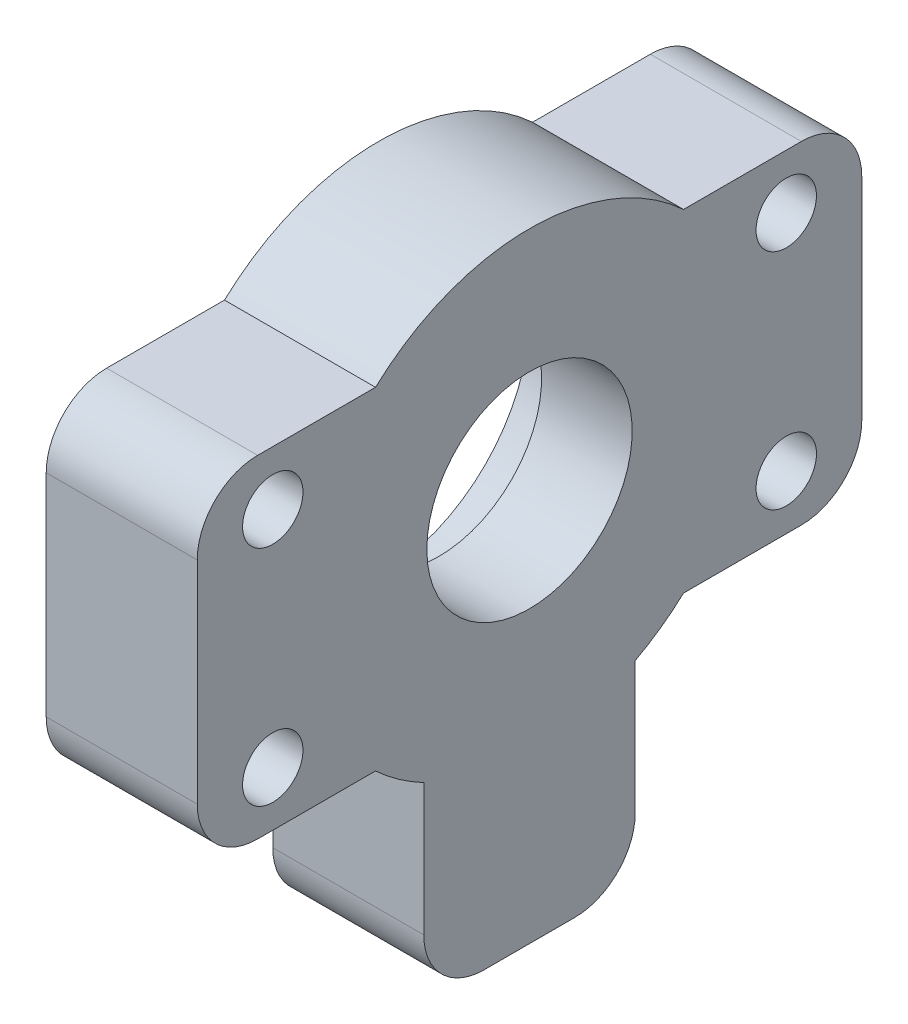
ISO-10303-21;
HEADER;
FILE_DESCRIPTION(('STEP AP214'),'2;1');
FILE_NAME('part.step','',(''),(''),'','','');
FILE_SCHEMA(('AUTOMOTIVE_DESIGN { 1 0 10303 214 1 1 1 1 }'));
ENDSEC;
DATA;
#1=APPLICATION_CONTEXT('core data for automotive mechanical design processes');
#2=APPLICATION_PROTOCOL_DEFINITION('international standard','automotive_design',2000,#1);
#3=PRODUCT_CONTEXT('',#1,'mechanical');
#4=PRODUCT('Part','Part','',(#3));
#5=PRODUCT_RELATED_PRODUCT_CATEGORY('part','',(#4));
#6=PRODUCT_DEFINITION_FORMATION('','',#4);
#7=PRODUCT_DEFINITION_CONTEXT('part definition',#1,'design');
#8=PRODUCT_DEFINITION('design','',#6,#7);
#9=PRODUCT_DEFINITION_SHAPE('','',#8);
#10=(LENGTH_UNIT() NAMED_UNIT(*) SI_UNIT(.MILLI.,.METRE.));
#11=(NAMED_UNIT(*) PLANE_ANGLE_UNIT() SI_UNIT($,.RADIAN.));
#12=(NAMED_UNIT(*) SI_UNIT($,.STERADIAN.) SOLID_ANGLE_UNIT());
#13=UNCERTAINTY_MEASURE_WITH_UNIT(LENGTH_MEASURE(1.E-05),#10,'distance_accuracy_value','');
#14=(GEOMETRIC_REPRESENTATION_CONTEXT(3) GLOBAL_UNCERTAINTY_ASSIGNED_CONTEXT((#13)) GLOBAL_UNIT_ASSIGNED_CONTEXT((#10,
#11,#12)) REPRESENTATION_CONTEXT('',''));
#15=CARTESIAN_POINT('',(0.,0.,0.));
#16=DIRECTION('',(0.,0.,1.));
#17=DIRECTION('',(1.,0.,0.));
#18=AXIS2_PLACEMENT_3D('',#15,#16,#17);
#19=CARTESIAN_POINT('',(5.,0.,0.));
#20=DIRECTION('',(-1.,0.,0.));
#21=DIRECTION('',(0.,0.,1.));
#22=AXIS2_PLACEMENT_3D('',#19,#20,#21);
#23=CYLINDRICAL_SURFACE('',#22,7.5);
#24=CARTESIAN_POINT('',(5.,0.,0.));
#25=DIRECTION('',(1.,0.,0.));
#26=DIRECTION('',(0.,0.,-1.));
#27=AXIS2_PLACEMENT_3D('',#24,#25,#26);
#28=CIRCLE('',#27,7.5);
#29=CARTESIAN_POINT('',(5.,-6.6332495807108,-3.5));
#30=VERTEX_POINT('',#29);
#31=CARTESIAN_POINT('',(5.,-5.5,-5.09901951359279));
#32=VERTEX_POINT('',#31);
#33=EDGE_CURVE('E189',#30,#32,#28,.T.);
#34=ORIENTED_EDGE('',*,*,#33,.F.);
#35=DIRECTION('',(-1.,0.,0.));
#36=VECTOR('',#35,1.);
#37=CARTESIAN_POINT('',(5.,-6.6332495807108,-3.5));
#38=LINE('',#37,#36);
#39=CARTESIAN_POINT('',(0.,-6.6332495807108,-3.5));
#40=VERTEX_POINT('',#39);
#41=EDGE_CURVE('E179',#30,#40,#38,.T.);
#42=ORIENTED_EDGE('',*,*,#41,.T.);
#43=CARTESIAN_POINT('',(0.,0.,0.));
#44=DIRECTION('',(1.,0.,0.));
#45=DIRECTION('',(0.,0.,-1.));
#46=AXIS2_PLACEMENT_3D('',#43,#44,#45);
#47=CIRCLE('',#46,7.5);
#48=CARTESIAN_POINT('',(0.,-5.5,-5.09901951359279));
#49=VERTEX_POINT('',#48);
#50=EDGE_CURVE('E200',#40,#49,#47,.T.);
#51=ORIENTED_EDGE('',*,*,#50,.T.);
#52=DIRECTION('',(-1.,0.,0.));
#53=VECTOR('',#52,1.);
#54=CARTESIAN_POINT('',(5.,-5.5,-5.09901951359279));
#55=LINE('',#54,#53);
#56=EDGE_CURVE('E241',#49,#32,#55,.F.);
#57=ORIENTED_EDGE('',*,*,#56,.T.);
#58=EDGE_LOOP('',(#34,#42,#51,#57));
#59=FACE_BOUND('',#58,.T.);
#60=ADVANCED_FACE('F35',(#59),#23,.T.);
#61=CARTESIAN_POINT('',(5.,5.5,-5.09901951359279));
#62=VERTEX_POINT('',#61);
#63=CARTESIAN_POINT('',(5.,5.5,5.09901951359279));
#64=VERTEX_POINT('',#63);
#65=EDGE_CURVE('E191',#62,#64,#28,.T.);
#66=ORIENTED_EDGE('',*,*,#65,.F.);
#67=DIRECTION('',(-1.,0.,0.));
#68=VECTOR('',#67,1.);
#69=CARTESIAN_POINT('',(5.,5.5,-5.09901951359279));
#70=LINE('',#69,#68);
#71=CARTESIAN_POINT('',(0.,5.5,-5.09901951359279));
#72=VERTEX_POINT('',#71);
#73=EDGE_CURVE('E234',#62,#72,#70,.T.);
#74=ORIENTED_EDGE('',*,*,#73,.T.);
#75=CARTESIAN_POINT('',(0.,5.5,5.09901951359279));
#76=VERTEX_POINT('',#75);
#77=EDGE_CURVE('E201',#72,#76,#47,.T.);
#78=ORIENTED_EDGE('',*,*,#77,.T.);
#79=DIRECTION('',(-1.,0.,0.));
#80=VECTOR('',#79,1.);
#81=CARTESIAN_POINT('',(5.,5.5,5.09901951359279));
#82=LINE('',#81,#80);
#83=EDGE_CURVE('E219',#76,#64,#82,.F.);
#84=ORIENTED_EDGE('',*,*,#83,.T.);
#85=EDGE_LOOP('',(#66,#74,#78,#84));
#86=FACE_BOUND('',#85,.T.);
#87=ADVANCED_FACE('F368',(#86),#23,.T.);
#88=CARTESIAN_POINT('',(0.,-5.5,5.09901951359279));
#89=VERTEX_POINT('',#88);
#90=CARTESIAN_POINT('',(0.,-6.6332495807108,3.5));
#91=VERTEX_POINT('',#90);
#92=EDGE_CURVE('E178',#89,#91,#47,.T.);
#93=ORIENTED_EDGE('',*,*,#92,.T.);
#94=DIRECTION('',(-1.,0.,0.));
#95=VECTOR('',#94,1.);
#96=CARTESIAN_POINT('',(5.,-6.6332495807108,3.5));
#97=LINE('',#96,#95);
#98=CARTESIAN_POINT('',(5.,-6.6332495807108,3.5));
#99=VERTEX_POINT('',#98);
#100=EDGE_CURVE('E165',#91,#99,#97,.F.);
#101=ORIENTED_EDGE('',*,*,#100,.T.);
#102=CARTESIAN_POINT('',(5.,-5.5,5.09901951359279));
#103=VERTEX_POINT('',#102);
#104=EDGE_CURVE('E176',#103,#99,#28,.T.);
#105=ORIENTED_EDGE('',*,*,#104,.F.);
#106=DIRECTION('',(-1.,0.,0.));
#107=VECTOR('',#106,1.);
#108=CARTESIAN_POINT('',(5.,-5.5,5.09901951359279));
#109=LINE('',#108,#107);
#110=EDGE_CURVE('E223',#103,#89,#109,.T.);
#111=ORIENTED_EDGE('',*,*,#110,.T.);
#112=EDGE_LOOP('',(#93,#101,#105,#111));
#113=FACE_BOUND('',#112,.T.);
#114=ADVANCED_FACE('F174',(#113),#23,.T.);
#115=CARTESIAN_POINT('',(5.,0.,0.));
#116=DIRECTION('',(1.,0.,0.));
#117=DIRECTION('',(0.,0.,-1.));
#118=AXIS2_PLACEMENT_3D('',#115,#116,#117);
#119=PLANE('',#118);
#120=DIRECTION('',(0.,0.,-1.));
#121=VECTOR('',#120,1.);
#122=CARTESIAN_POINT('',(5.,-13.,-3.5));
#123=LINE('',#122,#121);
#124=CARTESIAN_POINT('',(5.,-13.,1.5));
#125=VERTEX_POINT('',#124);
#126=CARTESIAN_POINT('',(5.,-13.,-1.5));
#127=VERTEX_POINT('',#126);
#128=EDGE_CURVE('E169',#125,#127,#123,.T.);
#129=ORIENTED_EDGE('',*,*,#128,.T.);
#130=CARTESIAN_POINT('',(5.,-11.,-1.5));
#131=DIRECTION('',(1.,0.,0.));
#132=DIRECTION('',(0.,0.,-1.));
#133=AXIS2_PLACEMENT_3D('',#130,#131,#132);
#134=CIRCLE('',#133,2.);
#135=CARTESIAN_POINT('',(5.,-11.,-3.5));
#136=VERTEX_POINT('',#135);
#137=EDGE_CURVE('E351',#127,#136,#134,.T.);
#138=ORIENTED_EDGE('',*,*,#137,.T.);
#139=DIRECTION('',(0.,1.,0.));
#140=VECTOR('',#139,1.);
#141=CARTESIAN_POINT('',(5.,-5.5,-3.5));
#142=LINE('',#141,#140);
#143=EDGE_CURVE('E170',#136,#30,#142,.T.);
#144=ORIENTED_EDGE('',*,*,#143,.T.);
#145=ORIENTED_EDGE('',*,*,#33,.T.);
#146=DIRECTION('',(0.,0.,1.));
#147=VECTOR('',#146,1.);
#148=CARTESIAN_POINT('',(5.,-5.5,-11.));
#149=LINE('',#148,#147);
#150=CARTESIAN_POINT('',(5.,-5.5,-9.));
#151=VERTEX_POINT('',#150);
#152=EDGE_CURVE('E258',#151,#32,#149,.T.);
#153=ORIENTED_EDGE('',*,*,#152,.F.);
#154=CARTESIAN_POINT('',(5.,-3.5,-9.));
#155=DIRECTION('',(1.,0.,0.));
#156=DIRECTION('',(0.,0.,-1.));
#157=AXIS2_PLACEMENT_3D('',#154,#155,#156);
#158=CIRCLE('',#157,2.);
#159=CARTESIAN_POINT('',(5.,-3.5,-11.));
#160=VERTEX_POINT('',#159);
#161=EDGE_CURVE('E316',#151,#160,#158,.T.);
#162=ORIENTED_EDGE('',*,*,#161,.T.);
#163=DIRECTION('',(0.,-1.,0.));
#164=VECTOR('',#163,1.);
#165=CARTESIAN_POINT('',(5.,5.5,-11.));
#166=LINE('',#165,#164);
#167=CARTESIAN_POINT('',(5.,3.5,-11.));
#168=VERTEX_POINT('',#167);
#169=EDGE_CURVE('E248',#168,#160,#166,.T.);
#170=ORIENTED_EDGE('',*,*,#169,.F.);
#171=CARTESIAN_POINT('',(5.,3.5,-9.));
#172=DIRECTION('',(1.,0.,0.));
#173=DIRECTION('',(0.,0.,-1.));
#174=AXIS2_PLACEMENT_3D('',#171,#172,#173);
#175=CIRCLE('',#174,2.);
#176=CARTESIAN_POINT('',(5.,5.5,-9.));
#177=VERTEX_POINT('',#176);
#178=EDGE_CURVE('E322',#168,#177,#175,.T.);
#179=ORIENTED_EDGE('',*,*,#178,.T.);
#180=DIRECTION('',(0.,0.,-1.));
#181=VECTOR('',#180,1.);
#182=CARTESIAN_POINT('',(5.,5.5,-11.));
#183=LINE('',#182,#181);
#184=EDGE_CURVE('E244',#62,#177,#183,.T.);
#185=ORIENTED_EDGE('',*,*,#184,.F.);
#186=ORIENTED_EDGE('',*,*,#65,.T.);
#187=DIRECTION('',(0.,0.,-1.));
#188=VECTOR('',#187,1.);
#189=CARTESIAN_POINT('',(5.,5.5,5.));
#190=LINE('',#189,#188);
#191=CARTESIAN_POINT('',(5.,5.5,9.));
#192=VERTEX_POINT('',#191);
#193=EDGE_CURVE('E225',#192,#64,#190,.T.);
#194=ORIENTED_EDGE('',*,*,#193,.F.);
#195=CARTESIAN_POINT('',(5.,3.5,9.));
#196=DIRECTION('',(1.,0.,0.));
#197=DIRECTION('',(0.,0.,-1.));
#198=AXIS2_PLACEMENT_3D('',#195,#196,#197);
#199=CIRCLE('',#198,2.);
#200=CARTESIAN_POINT('',(5.,3.5,11.));
#201=VERTEX_POINT('',#200);
#202=EDGE_CURVE('E325',#192,#201,#199,.T.);
#203=ORIENTED_EDGE('',*,*,#202,.T.);
#204=DIRECTION('',(0.,1.,0.));
#205=VECTOR('',#204,1.);
#206=CARTESIAN_POINT('',(5.,5.5,11.));
#207=LINE('',#206,#205);
#208=CARTESIAN_POINT('',(5.,-3.5,11.));
#209=VERTEX_POINT('',#208);
#210=EDGE_CURVE('E236',#209,#201,#207,.T.);
#211=ORIENTED_EDGE('',*,*,#210,.F.);
#212=CARTESIAN_POINT('',(5.,-3.5,9.));
#213=DIRECTION('',(1.,0.,0.));
#214=DIRECTION('',(0.,0.,-1.));
#215=AXIS2_PLACEMENT_3D('',#212,#213,#214);
#216=CIRCLE('',#215,2.);
#217=CARTESIAN_POINT('',(5.,-5.5,9.));
#218=VERTEX_POINT('',#217);
#219=EDGE_CURVE('E323',#209,#218,#216,.T.);
#220=ORIENTED_EDGE('',*,*,#219,.T.);
#221=DIRECTION('',(0.,0.,1.));
#222=VECTOR('',#221,1.);
#223=CARTESIAN_POINT('',(5.,-5.5,5.));
#224=LINE('',#223,#222);
#225=EDGE_CURVE('E187',#103,#218,#224,.T.);
#226=ORIENTED_EDGE('',*,*,#225,.F.);
#227=ORIENTED_EDGE('',*,*,#104,.T.);
#228=DIRECTION('',(0.,-1.,0.));
#229=VECTOR('',#228,1.);
#230=CARTESIAN_POINT('',(5.,-5.5,3.5));
#231=LINE('',#230,#229);
#232=CARTESIAN_POINT('',(5.,-11.,3.5));
#233=VERTEX_POINT('',#232);
#234=EDGE_CURVE('E162',#99,#233,#231,.T.);
#235=ORIENTED_EDGE('',*,*,#234,.T.);
#236=CARTESIAN_POINT('',(5.,-11.,1.5));
#237=DIRECTION('',(1.,0.,0.));
#238=DIRECTION('',(0.,0.,-1.));
#239=AXIS2_PLACEMENT_3D('',#236,#237,#238);
#240=CIRCLE('',#239,2.);
#241=EDGE_CURVE('E349',#233,#125,#240,.T.);
#242=ORIENTED_EDGE('',*,*,#241,.T.);
#243=EDGE_LOOP('',(#129,#138,#144,#145,#153,#162,#170,#179,#185,#186,#194,#203,#211,#220,#226,
#227,#235,#242));
#244=FACE_BOUND('',#243,.T.);
#245=CARTESIAN_POINT('',(5.,3.7,8.5));
#246=DIRECTION('',(-1.,0.,0.));
#247=DIRECTION('',(0.,0.,-1.));
#248=AXIS2_PLACEMENT_3D('',#245,#246,#247);
#249=CIRCLE('',#248,1.);
#250=CARTESIAN_POINT('',(5.,3.7,7.5));
#251=VERTEX_POINT('',#250);
#252=EDGE_CURVE('E267',#251,#251,#249,.T.);
#253=ORIENTED_EDGE('',*,*,#252,.T.);
#254=EDGE_LOOP('',(#253));
#255=FACE_BOUND('',#254,.T.);
#256=CARTESIAN_POINT('',(5.,-3.7,-8.5));
#257=DIRECTION('',(-1.,0.,0.));
#258=DIRECTION('',(0.,0.,-1.));
#259=AXIS2_PLACEMENT_3D('',#256,#257,#258);
#260=CIRCLE('',#259,1.);
#261=CARTESIAN_POINT('',(5.,-3.7,-9.5));
#262=VERTEX_POINT('',#261);
#263=EDGE_CURVE('E280',#262,#262,#260,.T.);
#264=ORIENTED_EDGE('',*,*,#263,.T.);
#265=EDGE_LOOP('',(#264));
#266=FACE_BOUND('',#265,.T.);
#267=CARTESIAN_POINT('',(5.,3.7,-8.5));
#268=DIRECTION('',(-1.,0.,0.));
#269=DIRECTION('',(0.,0.,1.));
#270=AXIS2_PLACEMENT_3D('',#267,#268,#269);
#271=CIRCLE('',#270,1.);
#272=CARTESIAN_POINT('',(5.,3.7,-7.5));
#273=VERTEX_POINT('',#272);
#274=EDGE_CURVE('E274',#273,#273,#271,.T.);
#275=ORIENTED_EDGE('',*,*,#274,.T.);
#276=EDGE_LOOP('',(#275));
#277=FACE_BOUND('',#276,.T.);
#278=CARTESIAN_POINT('',(5.,-3.7,8.5));
#279=DIRECTION('',(-1.,0.,0.));
#280=DIRECTION('',(0.,0.,1.));
#281=AXIS2_PLACEMENT_3D('',#278,#279,#280);
#282=CIRCLE('',#281,1.);
#283=CARTESIAN_POINT('',(5.,-3.7,9.5));
#284=VERTEX_POINT('',#283);
#285=EDGE_CURVE('E266',#284,#284,#282,.T.);
#286=ORIENTED_EDGE('',*,*,#285,.T.);
#287=EDGE_LOOP('',(#286));
#288=FACE_BOUND('',#287,.T.);
#289=CARTESIAN_POINT('',(5.,0.,0.));
#290=DIRECTION('',(-1.,0.,0.));
#291=DIRECTION('',(0.,0.,1.));
#292=AXIS2_PLACEMENT_3D('',#289,#290,#291);
#293=CIRCLE('',#292,3.4);
#294=CARTESIAN_POINT('',(5.,0.,3.4));
#295=VERTEX_POINT('',#294);
#296=EDGE_CURVE('E214',#295,#295,#293,.T.);
#297=ORIENTED_EDGE('',*,*,#296,.T.);
#298=EDGE_LOOP('',(#297));
#299=FACE_BOUND('',#298,.T.);
#300=ADVANCED_FACE('F184',(#244,#255,#266,#277,#288,#299),#119,.T.);
#301=CARTESIAN_POINT('',(0.,0.,0.));
#302=DIRECTION('',(1.,0.,0.));
#303=DIRECTION('',(0.,0.,-1.));
#304=AXIS2_PLACEMENT_3D('',#301,#302,#303);
#305=PLANE('',#304);
#306=CARTESIAN_POINT('',(0.,-10.,0.));
#307=DIRECTION('',(1.,0.,0.));
#308=DIRECTION('',(0.,0.,-1.));
#309=AXIS2_PLACEMENT_3D('',#306,#307,#308);
#310=CIRCLE('',#309,2.65);
#311=CARTESIAN_POINT('',(0.,-10.,-2.65));
#312=VERTEX_POINT('',#311);
#313=EDGE_CURVE('E293',#312,#312,#310,.T.);
#314=ORIENTED_EDGE('',*,*,#313,.T.);
#315=EDGE_LOOP('',(#314));
#316=FACE_BOUND('',#315,.T.);
#317=DIRECTION('',(0.,1.,0.));
#318=VECTOR('',#317,1.);
#319=CARTESIAN_POINT('',(0.,-5.5,-3.5));
#320=LINE('',#319,#318);
#321=CARTESIAN_POINT('',(0.,-11.,-3.5));
#322=VERTEX_POINT('',#321);
#323=EDGE_CURVE('E290',#322,#40,#320,.T.);
#324=ORIENTED_EDGE('',*,*,#323,.F.);
#325=CARTESIAN_POINT('',(0.,-11.,-1.5));
#326=DIRECTION('',(1.,0.,0.));
#327=DIRECTION('',(0.,0.,-1.));
#328=AXIS2_PLACEMENT_3D('',#325,#326,#327);
#329=CIRCLE('',#328,2.);
#330=CARTESIAN_POINT('',(0.,-13.,-1.5));
#331=VERTEX_POINT('',#330);
#332=EDGE_CURVE('E43',#322,#331,#329,.F.);
#333=ORIENTED_EDGE('',*,*,#332,.T.);
#334=DIRECTION('',(0.,0.,-1.));
#335=VECTOR('',#334,1.);
#336=CARTESIAN_POINT('',(0.,-13.,-3.5));
#337=LINE('',#336,#335);
#338=CARTESIAN_POINT('',(0.,-13.,1.5));
#339=VERTEX_POINT('',#338);
#340=EDGE_CURVE('E180',#339,#331,#337,.T.);
#341=ORIENTED_EDGE('',*,*,#340,.F.);
#342=CARTESIAN_POINT('',(0.,-11.,1.5));
#343=DIRECTION('',(1.,0.,0.));
#344=DIRECTION('',(0.,0.,-1.));
#345=AXIS2_PLACEMENT_3D('',#342,#343,#344);
#346=CIRCLE('',#345,2.);
#347=CARTESIAN_POINT('',(0.,-11.,3.5));
#348=VERTEX_POINT('',#347);
#349=EDGE_CURVE('E50',#339,#348,#346,.F.);
#350=ORIENTED_EDGE('',*,*,#349,.T.);
#351=DIRECTION('',(0.,-1.,0.));
#352=VECTOR('',#351,1.);
#353=CARTESIAN_POINT('',(0.,-5.5,3.5));
#354=LINE('',#353,#352);
#355=EDGE_CURVE('E296',#91,#348,#354,.T.);
#356=ORIENTED_EDGE('',*,*,#355,.F.);
#357=ORIENTED_EDGE('',*,*,#92,.F.);
#358=DIRECTION('',(0.,0.,1.));
#359=VECTOR('',#358,1.);
#360=CARTESIAN_POINT('',(0.,-5.5,5.));
#361=LINE('',#360,#359);
#362=CARTESIAN_POINT('',(0.,-5.5,9.));
#363=VERTEX_POINT('',#362);
#364=EDGE_CURVE('E231',#89,#363,#361,.T.);
#365=ORIENTED_EDGE('',*,*,#364,.T.);
#366=CARTESIAN_POINT('',(0.,-3.5,9.));
#367=DIRECTION('',(1.,0.,0.));
#368=DIRECTION('',(0.,0.,-1.));
#369=AXIS2_PLACEMENT_3D('',#366,#367,#368);
#370=CIRCLE('',#369,2.);
#371=CARTESIAN_POINT('',(0.,-3.5,11.));
#372=VERTEX_POINT('',#371);
#373=EDGE_CURVE('E662',#363,#372,#370,.F.);
#374=ORIENTED_EDGE('',*,*,#373,.T.);
#375=DIRECTION('',(0.,1.,0.));
#376=VECTOR('',#375,1.);
#377=CARTESIAN_POINT('',(0.,5.5,11.));
#378=LINE('',#377,#376);
#379=CARTESIAN_POINT('',(0.,3.5,11.));
#380=VERTEX_POINT('',#379);
#381=EDGE_CURVE('E228',#372,#380,#378,.T.);
#382=ORIENTED_EDGE('',*,*,#381,.T.);
#383=CARTESIAN_POINT('',(0.,3.5,9.));
#384=DIRECTION('',(1.,0.,0.));
#385=DIRECTION('',(0.,0.,-1.));
#386=AXIS2_PLACEMENT_3D('',#383,#384,#385);
#387=CIRCLE('',#386,2.);
#388=CARTESIAN_POINT('',(0.,5.5,9.));
#389=VERTEX_POINT('',#388);
#390=EDGE_CURVE('E670',#380,#389,#387,.F.);
#391=ORIENTED_EDGE('',*,*,#390,.T.);
#392=DIRECTION('',(0.,0.,-1.));
#393=VECTOR('',#392,1.);
#394=CARTESIAN_POINT('',(0.,5.5,5.));
#395=LINE('',#394,#393);
#396=EDGE_CURVE('E226',#389,#76,#395,.T.);
#397=ORIENTED_EDGE('',*,*,#396,.T.);
#398=ORIENTED_EDGE('',*,*,#77,.F.);
#399=DIRECTION('',(0.,0.,-1.));
#400=VECTOR('',#399,1.);
#401=CARTESIAN_POINT('',(0.,5.5,-11.));
#402=LINE('',#401,#400);
#403=CARTESIAN_POINT('',(0.,5.5,-9.));
#404=VERTEX_POINT('',#403);
#405=EDGE_CURVE('E245',#72,#404,#402,.T.);
#406=ORIENTED_EDGE('',*,*,#405,.T.);
#407=CARTESIAN_POINT('',(0.,3.5,-9.));
#408=DIRECTION('',(1.,0.,0.));
#409=DIRECTION('',(0.,0.,-1.));
#410=AXIS2_PLACEMENT_3D('',#407,#408,#409);
#411=CIRCLE('',#410,2.);
#412=CARTESIAN_POINT('',(0.,3.5,-11.));
#413=VERTEX_POINT('',#412);
#414=EDGE_CURVE('E665',#404,#413,#411,.F.);
#415=ORIENTED_EDGE('',*,*,#414,.T.);
#416=DIRECTION('',(0.,-1.,0.));
#417=VECTOR('',#416,1.);
#418=CARTESIAN_POINT('',(0.,5.5,-11.));
#419=LINE('',#418,#417);
#420=CARTESIAN_POINT('',(0.,-3.5,-11.));
#421=VERTEX_POINT('',#420);
#422=EDGE_CURVE('E252',#413,#421,#419,.T.);
#423=ORIENTED_EDGE('',*,*,#422,.T.);
#424=CARTESIAN_POINT('',(0.,-3.5,-9.));
#425=DIRECTION('',(1.,0.,0.));
#426=DIRECTION('',(0.,0.,-1.));
#427=AXIS2_PLACEMENT_3D('',#424,#425,#426);
#428=CIRCLE('',#427,2.);
#429=CARTESIAN_POINT('',(0.,-5.5,-9.));
#430=VERTEX_POINT('',#429);
#431=EDGE_CURVE('E308',#421,#430,#428,.F.);
#432=ORIENTED_EDGE('',*,*,#431,.T.);
#433=DIRECTION('',(0.,0.,1.));
#434=VECTOR('',#433,1.);
#435=CARTESIAN_POINT('',(0.,-5.5,-11.));
#436=LINE('',#435,#434);
#437=EDGE_CURVE('E249',#430,#49,#436,.T.);
#438=ORIENTED_EDGE('',*,*,#437,.T.);
#439=ORIENTED_EDGE('',*,*,#50,.F.);
#440=EDGE_LOOP('',(#324,#333,#341,#350,#356,#357,#365,#374,#382,#391,#397,#398,#406,#415,#423,
#432,#438,#439));
#441=FACE_BOUND('',#440,.T.);
#442=CARTESIAN_POINT('',(0.,3.7,8.5));
#443=DIRECTION('',(-1.,0.,0.));
#444=DIRECTION('',(0.,0.,-1.));
#445=AXIS2_PLACEMENT_3D('',#442,#443,#444);
#446=CIRCLE('',#445,1.);
#447=CARTESIAN_POINT('',(0.,3.7,7.5));
#448=VERTEX_POINT('',#447);
#449=EDGE_CURVE('E283',#448,#448,#446,.T.);
#450=ORIENTED_EDGE('',*,*,#449,.F.);
#451=EDGE_LOOP('',(#450));
#452=FACE_BOUND('',#451,.T.);
#453=CARTESIAN_POINT('',(0.,-3.7,-8.5));
#454=DIRECTION('',(-1.,0.,0.));
#455=DIRECTION('',(0.,0.,-1.));
#456=AXIS2_PLACEMENT_3D('',#453,#454,#455);
#457=CIRCLE('',#456,1.);
#458=CARTESIAN_POINT('',(0.,-3.7,-9.5));
#459=VERTEX_POINT('',#458);
#460=EDGE_CURVE('E277',#459,#459,#457,.T.);
#461=ORIENTED_EDGE('',*,*,#460,.F.);
#462=EDGE_LOOP('',(#461));
#463=FACE_BOUND('',#462,.T.);
#464=CARTESIAN_POINT('',(0.,3.7,-8.5));
#465=DIRECTION('',(-1.,0.,0.));
#466=DIRECTION('',(0.,0.,1.));
#467=AXIS2_PLACEMENT_3D('',#464,#465,#466);
#468=CIRCLE('',#467,1.);
#469=CARTESIAN_POINT('',(0.,3.7,-7.5));
#470=VERTEX_POINT('',#469);
#471=EDGE_CURVE('E271',#470,#470,#468,.T.);
#472=ORIENTED_EDGE('',*,*,#471,.F.);
#473=EDGE_LOOP('',(#472));
#474=FACE_BOUND('',#473,.T.);
#475=CARTESIAN_POINT('',(0.,-3.7,8.5));
#476=DIRECTION('',(-1.,0.,0.));
#477=DIRECTION('',(0.,0.,1.));
#478=AXIS2_PLACEMENT_3D('',#475,#476,#477);
#479=CIRCLE('',#478,1.);
#480=CARTESIAN_POINT('',(0.,-3.7,9.5));
#481=VERTEX_POINT('',#480);
#482=EDGE_CURVE('E263',#481,#481,#479,.T.);
#483=ORIENTED_EDGE('',*,*,#482,.F.);
#484=EDGE_LOOP('',(#483));
#485=FACE_BOUND('',#484,.T.);
#486=CARTESIAN_POINT('',(0.,0.,-8.));
#487=DIRECTION('',(1.,0.,0.));
#488=DIRECTION('',(0.,0.,-1.));
#489=AXIS2_PLACEMENT_3D('',#486,#487,#488);
#490=CIRCLE('',#489,2.65);
#491=CARTESIAN_POINT('',(0.,0.,-10.65));
#492=VERTEX_POINT('',#491);
#493=EDGE_CURVE('E270',#492,#492,#490,.F.);
#494=ORIENTED_EDGE('',*,*,#493,.F.);
#495=EDGE_LOOP('',(#494));
#496=FACE_BOUND('',#495,.T.);
#497=CARTESIAN_POINT('',(0.,0.,8.));
#498=DIRECTION('',(1.,0.,0.));
#499=DIRECTION('',(0.,0.,-1.));
#500=AXIS2_PLACEMENT_3D('',#497,#498,#499);
#501=CIRCLE('',#500,2.65);
#502=CARTESIAN_POINT('',(0.,0.,5.35));
#503=VERTEX_POINT('',#502);
#504=EDGE_CURVE('E255',#503,#503,#501,.F.);
#505=ORIENTED_EDGE('',*,*,#504,.F.);
#506=EDGE_LOOP('',(#505));
#507=FACE_BOUND('',#506,.T.);
#508=CARTESIAN_POINT('',(0.,0.,0.));
#509=DIRECTION('',(-1.,0.,0.));
#510=DIRECTION('',(0.,0.,1.));
#511=AXIS2_PLACEMENT_3D('',#508,#509,#510);
#512=CIRCLE('',#511,5.);
#513=CARTESIAN_POINT('',(0.,0.,5.));
#514=VERTEX_POINT('',#513);
#515=EDGE_CURVE('E209',#514,#514,#512,.T.);
#516=ORIENTED_EDGE('',*,*,#515,.F.);
#517=EDGE_LOOP('',(#516));
#518=FACE_BOUND('',#517,.T.);
#519=ADVANCED_FACE('F304',(#316,#441,#452,#463,#474,#485,#496,#507,#518),#305,.F.);
#520=CARTESIAN_POINT('',(2.,0.,0.));
#521=DIRECTION('',(-1.,0.,0.));
#522=DIRECTION('',(0.,0.,1.));
#523=AXIS2_PLACEMENT_3D('',#520,#521,#522);
#524=CYLINDRICAL_SURFACE('',#523,5.);
#525=CARTESIAN_POINT('',(2.,0.,0.));
#526=DIRECTION('',(-1.,0.,0.));
#527=DIRECTION('',(0.,0.,1.));
#528=AXIS2_PLACEMENT_3D('',#525,#526,#527);
#529=CIRCLE('',#528,5.);
#530=CARTESIAN_POINT('',(2.,0.,5.));
#531=VERTEX_POINT('',#530);
#532=EDGE_CURVE('E204',#531,#531,#529,.T.);
#533=ORIENTED_EDGE('',*,*,#532,.F.);
#534=EDGE_LOOP('',(#533));
#535=FACE_BOUND('',#534,.T.);
#536=ORIENTED_EDGE('',*,*,#515,.T.);
#537=EDGE_LOOP('',(#536));
#538=FACE_BOUND('',#537,.T.);
#539=ADVANCED_FACE('F383',(#535,#538),#524,.F.);
#540=CARTESIAN_POINT('',(2.,0.,0.));
#541=DIRECTION('',(-1.,0.,0.));
#542=DIRECTION('',(0.,0.,1.));
#543=AXIS2_PLACEMENT_3D('',#540,#541,#542);
#544=PLANE('',#543);
#545=CARTESIAN_POINT('',(2.,0.,0.));
#546=DIRECTION('',(-1.,0.,0.));
#547=DIRECTION('',(0.,0.,1.));
#548=AXIS2_PLACEMENT_3D('',#545,#546,#547);
#549=CIRCLE('',#548,3.4);
#550=CARTESIAN_POINT('',(2.,0.,3.4));
#551=VERTEX_POINT('',#550);
#552=EDGE_CURVE('E216',#551,#551,#549,.T.);
#553=ORIENTED_EDGE('',*,*,#552,.F.);
#554=EDGE_LOOP('',(#553));
#555=FACE_BOUND('',#554,.T.);
#556=ORIENTED_EDGE('',*,*,#532,.T.);
#557=EDGE_LOOP('',(#556));
#558=FACE_BOUND('',#557,.T.);
#559=ADVANCED_FACE('F388',(#555,#558),#544,.T.);
#560=CARTESIAN_POINT('',(5.,0.,0.));
#561=DIRECTION('',(-1.,0.,0.));
#562=DIRECTION('',(0.,0.,1.));
#563=AXIS2_PLACEMENT_3D('',#560,#561,#562);
#564=CYLINDRICAL_SURFACE('',#563,3.4);
#565=ORIENTED_EDGE('',*,*,#296,.F.);
#566=EDGE_LOOP('',(#565));
#567=FACE_BOUND('',#566,.T.);
#568=ORIENTED_EDGE('',*,*,#552,.T.);
#569=EDGE_LOOP('',(#568));
#570=FACE_BOUND('',#569,.T.);
#571=ADVANCED_FACE('F392',(#567,#570),#564,.F.);
#572=CARTESIAN_POINT('',(5.,5.5,5.));
#573=DIRECTION('',(0.,1.,0.));
#574=DIRECTION('',(0.,0.,1.));
#575=AXIS2_PLACEMENT_3D('',#572,#573,#574);
#576=PLANE('',#575);
#577=ORIENTED_EDGE('',*,*,#396,.F.);
#578=DIRECTION('',(-1.,0.,0.));
#579=VECTOR('',#578,1.);
#580=CARTESIAN_POINT('',(5.,5.5,9.));
#581=LINE('',#580,#579);
#582=EDGE_CURVE('E327',#389,#192,#581,.F.);
#583=ORIENTED_EDGE('',*,*,#582,.T.);
#584=ORIENTED_EDGE('',*,*,#193,.T.);
#585=ORIENTED_EDGE('',*,*,#83,.F.);
#586=EDGE_LOOP('',(#577,#583,#584,#585));
#587=FACE_BOUND('',#586,.T.);
#588=ADVANCED_FACE('F396',(#587),#576,.T.);
#589=CARTESIAN_POINT('',(5.,-5.5,5.));
#590=DIRECTION('',(0.,-1.,0.));
#591=DIRECTION('',(0.,0.,-1.));
#592=AXIS2_PLACEMENT_3D('',#589,#590,#591);
#593=PLANE('',#592);
#594=ORIENTED_EDGE('',*,*,#225,.T.);
#595=DIRECTION('',(-1.,0.,0.));
#596=VECTOR('',#595,1.);
#597=CARTESIAN_POINT('',(5.,-5.5,9.));
#598=LINE('',#597,#596);
#599=EDGE_CURVE('E339',#218,#363,#598,.T.);
#600=ORIENTED_EDGE('',*,*,#599,.T.);
#601=ORIENTED_EDGE('',*,*,#364,.F.);
#602=ORIENTED_EDGE('',*,*,#110,.F.);
#603=EDGE_LOOP('',(#594,#600,#601,#602));
#604=FACE_BOUND('',#603,.T.);
#605=ADVANCED_FACE('F398',(#604),#593,.T.);
#606=CARTESIAN_POINT('',(5.,5.5,11.));
#607=DIRECTION('',(0.,0.,1.));
#608=DIRECTION('',(1.,0.,0.));
#609=AXIS2_PLACEMENT_3D('',#606,#607,#608);
#610=PLANE('',#609);
#611=ORIENTED_EDGE('',*,*,#210,.T.);
#612=DIRECTION('',(-1.,0.,0.));
#613=VECTOR('',#612,1.);
#614=CARTESIAN_POINT('',(5.,3.5,11.));
#615=LINE('',#614,#613);
#616=EDGE_CURVE('E192',#201,#380,#615,.T.);
#617=ORIENTED_EDGE('',*,*,#616,.T.);
#618=ORIENTED_EDGE('',*,*,#381,.F.);
#619=DIRECTION('',(-1.,0.,0.));
#620=VECTOR('',#619,1.);
#621=CARTESIAN_POINT('',(5.,-3.5,11.));
#622=LINE('',#621,#620);
#623=EDGE_CURVE('E188',#372,#209,#622,.F.);
#624=ORIENTED_EDGE('',*,*,#623,.T.);
#625=EDGE_LOOP('',(#611,#617,#618,#624));
#626=FACE_BOUND('',#625,.T.);
#627=ADVANCED_FACE('F401',(#626),#610,.T.);
#628=CARTESIAN_POINT('',(5.,5.5,-11.));
#629=DIRECTION('',(0.,1.,0.));
#630=DIRECTION('',(0.,0.,1.));
#631=AXIS2_PLACEMENT_3D('',#628,#629,#630);
#632=PLANE('',#631);
#633=ORIENTED_EDGE('',*,*,#184,.T.);
#634=DIRECTION('',(-1.,0.,0.));
#635=VECTOR('',#634,1.);
#636=CARTESIAN_POINT('',(5.,5.5,-9.));
#637=LINE('',#636,#635);
#638=EDGE_CURVE('E332',#177,#404,#637,.T.);
#639=ORIENTED_EDGE('',*,*,#638,.T.);
#640=ORIENTED_EDGE('',*,*,#405,.F.);
#641=ORIENTED_EDGE('',*,*,#73,.F.);
#642=EDGE_LOOP('',(#633,#639,#640,#641));
#643=FACE_BOUND('',#642,.T.);
#644=ADVANCED_FACE('F405',(#643),#632,.T.);
#645=CARTESIAN_POINT('',(5.,-5.5,-11.));
#646=DIRECTION('',(0.,-1.,0.));
#647=DIRECTION('',(0.,0.,-1.));
#648=AXIS2_PLACEMENT_3D('',#645,#646,#647);
#649=PLANE('',#648);
#650=ORIENTED_EDGE('',*,*,#437,.F.);
#651=DIRECTION('',(-1.,0.,0.));
#652=VECTOR('',#651,1.);
#653=CARTESIAN_POINT('',(5.,-5.5,-9.));
#654=LINE('',#653,#652);
#655=EDGE_CURVE('E313',#430,#151,#654,.F.);
#656=ORIENTED_EDGE('',*,*,#655,.T.);
#657=ORIENTED_EDGE('',*,*,#152,.T.);
#658=ORIENTED_EDGE('',*,*,#56,.F.);
#659=EDGE_LOOP('',(#650,#656,#657,#658));
#660=FACE_BOUND('',#659,.T.);
#661=ADVANCED_FACE('F311',(#660),#649,.T.);
#662=CARTESIAN_POINT('',(5.,5.5,-11.));
#663=DIRECTION('',(0.,0.,-1.));
#664=DIRECTION('',(-1.,0.,0.));
#665=AXIS2_PLACEMENT_3D('',#662,#663,#664);
#666=PLANE('',#665);
#667=ORIENTED_EDGE('',*,*,#422,.F.);
#668=DIRECTION('',(-1.,0.,0.));
#669=VECTOR('',#668,1.);
#670=CARTESIAN_POINT('',(5.,3.5,-11.));
#671=LINE('',#670,#669);
#672=EDGE_CURVE('E336',#413,#168,#671,.F.);
#673=ORIENTED_EDGE('',*,*,#672,.T.);
#674=ORIENTED_EDGE('',*,*,#169,.T.);
#675=DIRECTION('',(-1.,0.,0.));
#676=VECTOR('',#675,1.);
#677=CARTESIAN_POINT('',(5.,-3.5,-11.));
#678=LINE('',#677,#676);
#679=EDGE_CURVE('E321',#160,#421,#678,.T.);
#680=ORIENTED_EDGE('',*,*,#679,.T.);
#681=EDGE_LOOP('',(#667,#673,#674,#680));
#682=FACE_BOUND('',#681,.T.);
#683=ADVANCED_FACE('F410',(#682),#666,.T.);
#684=CARTESIAN_POINT('',(0.,0.,8.));
#685=DIRECTION('',(0.,1.,0.));
#686=DIRECTION('',(0.,0.,1.));
#687=AXIS2_PLACEMENT_3D('',#684,#685,#686);
#688=SPHERICAL_SURFACE('',#687,2.65);
#689=CARTESIAN_POINT('',(0.,0.,8.));
#690=DIRECTION('',(1.,0.,0.));
#691=DIRECTION('',(0.,0.,-1.));
#692=AXIS2_PLACEMENT_3D('',#689,#690,#691);
#693=SPHERICAL_SURFACE('',#692,2.65);
#694=ORIENTED_EDGE('',*,*,#504,.T.);
#695=EDGE_LOOP('',(#694));
#696=FACE_BOUND('',#695,.T.);
#697=ADVANCED_FACE('F413',(#696),#693,.F.);
#698=CARTESIAN_POINT('',(0.,0.,-8.));
#699=DIRECTION('',(0.,1.,0.));
#700=DIRECTION('',(0.,0.,1.));
#701=AXIS2_PLACEMENT_3D('',#698,#699,#700);
#702=SPHERICAL_SURFACE('',#701,2.65);
#703=CARTESIAN_POINT('',(0.,0.,-8.));
#704=DIRECTION('',(1.,0.,0.));
#705=DIRECTION('',(0.,0.,-1.));
#706=AXIS2_PLACEMENT_3D('',#703,#704,#705);
#707=SPHERICAL_SURFACE('',#706,2.65);
#708=ORIENTED_EDGE('',*,*,#493,.T.);
#709=EDGE_LOOP('',(#708));
#710=FACE_BOUND('',#709,.T.);
#711=ADVANCED_FACE('F422',(#710),#707,.F.);
#712=CARTESIAN_POINT('',(5.,3.5,9.));
#713=DIRECTION('',(-1.,0.,0.));
#714=DIRECTION('',(0.,0.,1.));
#715=AXIS2_PLACEMENT_3D('',#712,#713,#714);
#716=CYLINDRICAL_SURFACE('',#715,2.);
#717=ORIENTED_EDGE('',*,*,#202,.F.);
#718=ORIENTED_EDGE('',*,*,#582,.F.);
#719=ORIENTED_EDGE('',*,*,#390,.F.);
#720=ORIENTED_EDGE('',*,*,#616,.F.);
#721=EDGE_LOOP('',(#717,#718,#719,#720));
#722=FACE_BOUND('',#721,.T.);
#723=ADVANCED_FACE('F426',(#722),#716,.T.);
#724=CARTESIAN_POINT('',(5.,3.5,-9.));
#725=DIRECTION('',(-1.,0.,0.));
#726=DIRECTION('',(0.,0.,1.));
#727=AXIS2_PLACEMENT_3D('',#724,#725,#726);
#728=CYLINDRICAL_SURFACE('',#727,2.);
#729=ORIENTED_EDGE('',*,*,#178,.F.);
#730=ORIENTED_EDGE('',*,*,#672,.F.);
#731=ORIENTED_EDGE('',*,*,#414,.F.);
#732=ORIENTED_EDGE('',*,*,#638,.F.);
#733=EDGE_LOOP('',(#729,#730,#731,#732));
#734=FACE_BOUND('',#733,.T.);
#735=ADVANCED_FACE('F540',(#734),#728,.T.);
#736=CARTESIAN_POINT('',(5.,-3.5,-9.));
#737=DIRECTION('',(-1.,0.,0.));
#738=DIRECTION('',(0.,0.,1.));
#739=AXIS2_PLACEMENT_3D('',#736,#737,#738);
#740=CYLINDRICAL_SURFACE('',#739,2.);
#741=ORIENTED_EDGE('',*,*,#161,.F.);
#742=ORIENTED_EDGE('',*,*,#655,.F.);
#743=ORIENTED_EDGE('',*,*,#431,.F.);
#744=ORIENTED_EDGE('',*,*,#679,.F.);
#745=EDGE_LOOP('',(#741,#742,#743,#744));
#746=FACE_BOUND('',#745,.T.);
#747=ADVANCED_FACE('F319',(#746),#740,.T.);
#748=CARTESIAN_POINT('',(5.,-3.5,9.));
#749=DIRECTION('',(-1.,0.,0.));
#750=DIRECTION('',(0.,0.,1.));
#751=AXIS2_PLACEMENT_3D('',#748,#749,#750);
#752=CYLINDRICAL_SURFACE('',#751,2.);
#753=ORIENTED_EDGE('',*,*,#219,.F.);
#754=ORIENTED_EDGE('',*,*,#623,.F.);
#755=ORIENTED_EDGE('',*,*,#373,.F.);
#756=ORIENTED_EDGE('',*,*,#599,.F.);
#757=EDGE_LOOP('',(#753,#754,#755,#756));
#758=FACE_BOUND('',#757,.T.);
#759=ADVANCED_FACE('F432',(#758),#752,.T.);
#760=CARTESIAN_POINT('',(5.,-3.7,8.5));
#761=DIRECTION('',(-1.,0.,0.));
#762=DIRECTION('',(0.,0.,1.));
#763=AXIS2_PLACEMENT_3D('',#760,#761,#762);
#764=CYLINDRICAL_SURFACE('',#763,1.);
#765=ORIENTED_EDGE('',*,*,#285,.F.);
#766=EDGE_LOOP('',(#765));
#767=FACE_BOUND('',#766,.T.);
#768=ORIENTED_EDGE('',*,*,#482,.T.);
#769=EDGE_LOOP('',(#768));
#770=FACE_BOUND('',#769,.T.);
#771=ADVANCED_FACE('F428',(#767,#770),#764,.F.);
#772=CARTESIAN_POINT('',(5.,3.7,-8.5));
#773=DIRECTION('',(-1.,0.,0.));
#774=DIRECTION('',(0.,0.,1.));
#775=AXIS2_PLACEMENT_3D('',#772,#773,#774);
#776=CYLINDRICAL_SURFACE('',#775,1.);
#777=ORIENTED_EDGE('',*,*,#274,.F.);
#778=EDGE_LOOP('',(#777));
#779=FACE_BOUND('',#778,.T.);
#780=ORIENTED_EDGE('',*,*,#471,.T.);
#781=EDGE_LOOP('',(#780));
#782=FACE_BOUND('',#781,.T.);
#783=ADVANCED_FACE('F431',(#779,#782),#776,.F.);
#784=CARTESIAN_POINT('',(5.,-3.7,-8.5));
#785=DIRECTION('',(-1.,0.,0.));
#786=DIRECTION('',(0.,0.,1.));
#787=AXIS2_PLACEMENT_3D('',#784,#785,#786);
#788=CYLINDRICAL_SURFACE('',#787,1.);
#789=ORIENTED_EDGE('',*,*,#263,.F.);
#790=EDGE_LOOP('',(#789));
#791=FACE_BOUND('',#790,.T.);
#792=ORIENTED_EDGE('',*,*,#460,.T.);
#793=EDGE_LOOP('',(#792));
#794=FACE_BOUND('',#793,.T.);
#795=ADVANCED_FACE('F436',(#791,#794),#788,.F.);
#796=CARTESIAN_POINT('',(5.,3.7,8.5));
#797=DIRECTION('',(-1.,0.,0.));
#798=DIRECTION('',(0.,0.,1.));
#799=AXIS2_PLACEMENT_3D('',#796,#797,#798);
#800=CYLINDRICAL_SURFACE('',#799,1.);
#801=ORIENTED_EDGE('',*,*,#252,.F.);
#802=EDGE_LOOP('',(#801));
#803=FACE_BOUND('',#802,.T.);
#804=ORIENTED_EDGE('',*,*,#449,.T.);
#805=EDGE_LOOP('',(#804));
#806=FACE_BOUND('',#805,.T.);
#807=ADVANCED_FACE('F440',(#803,#806),#800,.F.);
#808=CARTESIAN_POINT('',(0.,-5.5,-3.5));
#809=DIRECTION('',(0.,0.,-1.));
#810=DIRECTION('',(0.,1.,0.));
#811=AXIS2_PLACEMENT_3D('',#808,#809,#810);
#812=PLANE('',#811);
#813=ORIENTED_EDGE('',*,*,#143,.F.);
#814=DIRECTION('',(1.,0.,0.));
#815=VECTOR('',#814,1.);
#816=CARTESIAN_POINT('',(0.,-11.,-3.5));
#817=LINE('',#816,#815);
#818=EDGE_CURVE('E58',#136,#322,#817,.F.);
#819=ORIENTED_EDGE('',*,*,#818,.T.);
#820=ORIENTED_EDGE('',*,*,#323,.T.);
#821=ORIENTED_EDGE('',*,*,#41,.F.);
#822=EDGE_LOOP('',(#813,#819,#820,#821));
#823=FACE_BOUND('',#822,.T.);
#824=ADVANCED_FACE('F299',(#823),#812,.T.);
#825=CARTESIAN_POINT('',(0.,-5.5,3.5));
#826=DIRECTION('',(0.,0.,1.));
#827=DIRECTION('',(0.,-1.,0.));
#828=AXIS2_PLACEMENT_3D('',#825,#826,#827);
#829=PLANE('',#828);
#830=ORIENTED_EDGE('',*,*,#355,.T.);
#831=DIRECTION('',(1.,0.,0.));
#832=VECTOR('',#831,1.);
#833=CARTESIAN_POINT('',(0.,-11.,3.5));
#834=LINE('',#833,#832);
#835=EDGE_CURVE('E11',#348,#233,#834,.T.);
#836=ORIENTED_EDGE('',*,*,#835,.T.);
#837=ORIENTED_EDGE('',*,*,#234,.F.);
#838=ORIENTED_EDGE('',*,*,#100,.F.);
#839=EDGE_LOOP('',(#830,#836,#837,#838));
#840=FACE_BOUND('',#839,.T.);
#841=ADVANCED_FACE('F164',(#840),#829,.T.);
#842=CARTESIAN_POINT('',(0.,-13.,-3.5));
#843=DIRECTION('',(0.,-1.,0.));
#844=DIRECTION('',(0.,0.,-1.));
#845=AXIS2_PLACEMENT_3D('',#842,#843,#844);
#846=PLANE('',#845);
#847=ORIENTED_EDGE('',*,*,#340,.T.);
#848=DIRECTION('',(1.,0.,0.));
#849=VECTOR('',#848,1.);
#850=CARTESIAN_POINT('',(0.,-13.,-1.5));
#851=LINE('',#850,#849);
#852=EDGE_CURVE('E346',#331,#127,#851,.T.);
#853=ORIENTED_EDGE('',*,*,#852,.T.);
#854=ORIENTED_EDGE('',*,*,#128,.F.);
#855=DIRECTION('',(1.,0.,0.));
#856=VECTOR('',#855,1.);
#857=CARTESIAN_POINT('',(0.,-13.,1.5));
#858=LINE('',#857,#856);
#859=EDGE_CURVE('E342',#125,#339,#858,.F.);
#860=ORIENTED_EDGE('',*,*,#859,.T.);
#861=EDGE_LOOP('',(#847,#853,#854,#860));
#862=FACE_BOUND('',#861,.T.);
#863=ADVANCED_FACE('F357',(#862),#846,.T.);
#864=CARTESIAN_POINT('',(0.,-10.,0.));
#865=DIRECTION('',(0.,1.,0.));
#866=DIRECTION('',(0.,0.,1.));
#867=AXIS2_PLACEMENT_3D('',#864,#865,#866);
#868=SPHERICAL_SURFACE('',#867,2.65);
#869=CARTESIAN_POINT('',(0.,-10.,0.));
#870=DIRECTION('',(1.,0.,0.));
#871=DIRECTION('',(0.,0.,-1.));
#872=AXIS2_PLACEMENT_3D('',#869,#870,#871);
#873=SPHERICAL_SURFACE('',#872,2.65);
#874=ORIENTED_EDGE('',*,*,#313,.F.);
#875=EDGE_LOOP('',(#874));
#876=FACE_BOUND('',#875,.T.);
#877=ADVANCED_FACE('F366',(#876),#873,.F.);
#878=CARTESIAN_POINT('',(0.,-11.,-1.5));
#879=DIRECTION('',(1.,0.,0.));
#880=DIRECTION('',(0.,0.,-1.));
#881=AXIS2_PLACEMENT_3D('',#878,#879,#880);
#882=CYLINDRICAL_SURFACE('',#881,2.);
#883=ORIENTED_EDGE('',*,*,#332,.F.);
#884=ORIENTED_EDGE('',*,*,#818,.F.);
#885=ORIENTED_EDGE('',*,*,#137,.F.);
#886=ORIENTED_EDGE('',*,*,#852,.F.);
#887=EDGE_LOOP('',(#883,#884,#885,#886));
#888=FACE_BOUND('',#887,.T.);
#889=ADVANCED_FACE('F360',(#888),#882,.T.);
#890=CARTESIAN_POINT('',(0.,-11.,1.5));
#891=DIRECTION('',(1.,0.,0.));
#892=DIRECTION('',(0.,0.,-1.));
#893=AXIS2_PLACEMENT_3D('',#890,#891,#892);
#894=CYLINDRICAL_SURFACE('',#893,2.);
#895=ORIENTED_EDGE('',*,*,#349,.F.);
#896=ORIENTED_EDGE('',*,*,#859,.F.);
#897=ORIENTED_EDGE('',*,*,#241,.F.);
#898=ORIENTED_EDGE('',*,*,#835,.F.);
#899=EDGE_LOOP('',(#895,#896,#897,#898));
#900=FACE_BOUND('',#899,.T.);
#901=ADVANCED_FACE('F37',(#900),#894,.T.);
#902=CLOSED_SHELL('',(#60,#87,#114,#300,#519,#539,#559,#571,#588,#605,#627,#644,#661,#683,#697,
#711,#723,#735,#747,#759,#771,#783,#795,#807,#824,#841,#863,#877,#889,#901));
#903=MANIFOLD_SOLID_BREP('B2',#902);
#904=ADVANCED_BREP_SHAPE_REPRESENTATION('',(#18,#903),#14);
#905=SHAPE_DEFINITION_REPRESENTATION(#9,#904);
ENDSEC;
END-ISO-10303-21;
